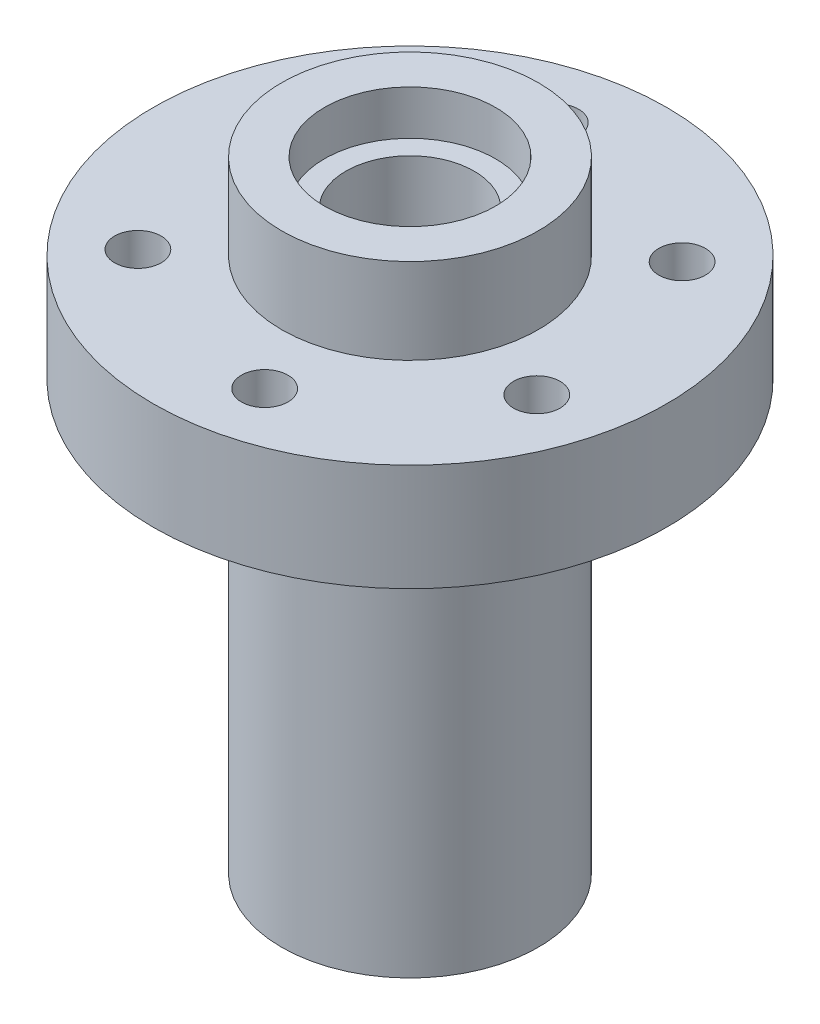
ISO-10303-21;
HEADER;
FILE_DESCRIPTION(('STEP AP214'),'2;1');
FILE_NAME('part.step','',(''),(''),'','','');
FILE_SCHEMA(('AUTOMOTIVE_DESIGN { 1 0 10303 214 1 1 1 1 }'));
ENDSEC;
DATA;
#1=APPLICATION_CONTEXT('core data for automotive mechanical design processes');
#2=APPLICATION_PROTOCOL_DEFINITION('international standard','automotive_design',2000,#1);
#3=PRODUCT_CONTEXT('',#1,'mechanical');
#4=PRODUCT('Part','Part','',(#3));
#5=PRODUCT_RELATED_PRODUCT_CATEGORY('part','',(#4));
#6=PRODUCT_DEFINITION_FORMATION('','',#4);
#7=PRODUCT_DEFINITION_CONTEXT('part definition',#1,'design');
#8=PRODUCT_DEFINITION('design','',#6,#7);
#9=PRODUCT_DEFINITION_SHAPE('','',#8);
#10=(LENGTH_UNIT() NAMED_UNIT(*) SI_UNIT(.MILLI.,.METRE.));
#11=(NAMED_UNIT(*) PLANE_ANGLE_UNIT() SI_UNIT($,.RADIAN.));
#12=(NAMED_UNIT(*) SI_UNIT($,.STERADIAN.) SOLID_ANGLE_UNIT());
#13=UNCERTAINTY_MEASURE_WITH_UNIT(LENGTH_MEASURE(1.E-05),#10,'distance_accuracy_value','');
#14=(GEOMETRIC_REPRESENTATION_CONTEXT(3) GLOBAL_UNCERTAINTY_ASSIGNED_CONTEXT((#13)) GLOBAL_UNIT_ASSIGNED_CONTEXT((#10,
#11,#12)) REPRESENTATION_CONTEXT('',''));
#15=CARTESIAN_POINT('',(0.,0.,0.));
#16=DIRECTION('',(0.,0.,1.));
#17=DIRECTION('',(1.,0.,0.));
#18=AXIS2_PLACEMENT_3D('',#15,#16,#17);
#19=CARTESIAN_POINT('',(0.,4.6355,0.));
#20=DIRECTION('',(0.,1.,0.));
#21=DIRECTION('',(0.,0.,1.));
#22=AXIS2_PLACEMENT_3D('',#19,#20,#21);
#23=PLANE('',#22);
#24=CARTESIAN_POINT('',(0.,4.6355,0.));
#25=DIRECTION('',(0.,1.,0.));
#26=DIRECTION('',(0.,0.,1.));
#27=AXIS2_PLACEMENT_3D('',#24,#25,#26);
#28=CIRCLE('',#27,4.7625);
#29=CARTESIAN_POINT('',(0.,4.6355,4.7625));
#30=VERTEX_POINT('',#29);
#31=EDGE_CURVE('E38',#30,#30,#28,.T.);
#32=ORIENTED_EDGE('',*,*,#31,.T.);
#33=EDGE_LOOP('',(#32));
#34=FACE_BOUND('',#33,.T.);
#35=ADVANCED_FACE('F35',(#34),#23,.T.);
#36=CARTESIAN_POINT('',(0.,4.6355,0.));
#37=DIRECTION('',(0.,1.,0.));
#38=DIRECTION('',(0.,0.,1.));
#39=AXIS2_PLACEMENT_3D('',#36,#37,#38);
#40=CYLINDRICAL_SURFACE('',#39,4.7625);
#41=CARTESIAN_POINT('',(0.,10.9855,0.));
#42=DIRECTION('',(0.,1.,0.));
#43=DIRECTION('',(0.,0.,1.));
#44=AXIS2_PLACEMENT_3D('',#41,#42,#43);
#45=CIRCLE('',#44,4.7625);
#46=CARTESIAN_POINT('',(0.,10.9855,4.7625));
#47=VERTEX_POINT('',#46);
#48=EDGE_CURVE('E126',#47,#47,#45,.F.);
#49=ORIENTED_EDGE('',*,*,#48,.F.);
#50=EDGE_LOOP('',(#49));
#51=FACE_BOUND('',#50,.T.);
#52=ORIENTED_EDGE('',*,*,#31,.F.);
#53=EDGE_LOOP('',(#52));
#54=FACE_BOUND('',#53,.T.);
#55=ADVANCED_FACE('F134',(#51,#54),#40,.F.);
#56=CARTESIAN_POINT('',(0.,10.9855,0.));
#57=DIRECTION('',(0.,1.,0.));
#58=DIRECTION('',(0.,0.,1.));
#59=AXIS2_PLACEMENT_3D('',#56,#57,#58);
#60=PLANE('',#59);
#61=ORIENTED_EDGE('',*,*,#48,.T.);
#62=EDGE_LOOP('',(#61));
#63=FACE_BOUND('',#62,.T.);
#64=CARTESIAN_POINT('',(0.,10.9855,0.));
#65=DIRECTION('',(0.,1.,0.));
#66=DIRECTION('',(0.,0.,1.));
#67=AXIS2_PLACEMENT_3D('',#64,#65,#66);
#68=CIRCLE('',#67,6.35);
#69=CARTESIAN_POINT('',(0.,10.9855,6.35));
#70=VERTEX_POINT('',#69);
#71=EDGE_CURVE('E124',#70,#70,#68,.T.);
#72=ORIENTED_EDGE('',*,*,#71,.T.);
#73=EDGE_LOOP('',(#72));
#74=FACE_BOUND('',#73,.T.);
#75=ADVANCED_FACE('F136',(#63,#74),#60,.T.);
#76=CARTESIAN_POINT('',(0.,10.9855,0.));
#77=DIRECTION('',(0.,1.,0.));
#78=DIRECTION('',(0.,0.,1.));
#79=AXIS2_PLACEMENT_3D('',#76,#77,#78);
#80=CYLINDRICAL_SURFACE('',#79,6.35);
#81=CARTESIAN_POINT('',(0.,14.2875,0.));
#82=DIRECTION('',(0.,1.,0.));
#83=DIRECTION('',(0.,0.,1.));
#84=AXIS2_PLACEMENT_3D('',#81,#82,#83);
#85=CIRCLE('',#84,6.35);
#86=CARTESIAN_POINT('',(0.,14.2875,6.35));
#87=VERTEX_POINT('',#86);
#88=EDGE_CURVE('E121',#87,#87,#85,.F.);
#89=ORIENTED_EDGE('',*,*,#88,.F.);
#90=EDGE_LOOP('',(#89));
#91=FACE_BOUND('',#90,.T.);
#92=ORIENTED_EDGE('',*,*,#71,.F.);
#93=EDGE_LOOP('',(#92));
#94=FACE_BOUND('',#93,.T.);
#95=ADVANCED_FACE('F142',(#91,#94),#80,.F.);
#96=CARTESIAN_POINT('',(0.,14.2875,0.));
#97=DIRECTION('',(0.,1.,0.));
#98=DIRECTION('',(0.,0.,1.));
#99=AXIS2_PLACEMENT_3D('',#96,#97,#98);
#100=PLANE('',#99);
#101=ORIENTED_EDGE('',*,*,#88,.T.);
#102=EDGE_LOOP('',(#101));
#103=FACE_BOUND('',#102,.T.);
#104=CARTESIAN_POINT('',(0.,14.2875,0.));
#105=DIRECTION('',(0.,-1.,0.));
#106=DIRECTION('',(0.,0.,-1.));
#107=AXIS2_PLACEMENT_3D('',#104,#105,#106);
#108=CIRCLE('',#107,9.525);
#109=CARTESIAN_POINT('',(0.,14.2875,-9.525));
#110=VERTEX_POINT('',#109);
#111=EDGE_CURVE('E118',#110,#110,#108,.T.);
#112=ORIENTED_EDGE('',*,*,#111,.F.);
#113=EDGE_LOOP('',(#112));
#114=FACE_BOUND('',#113,.T.);
#115=ADVANCED_FACE('F202',(#103,#114),#100,.T.);
#116=CARTESIAN_POINT('',(0.,14.2875,0.));
#117=DIRECTION('',(0.,-1.,0.));
#118=DIRECTION('',(0.,0.,-1.));
#119=AXIS2_PLACEMENT_3D('',#116,#117,#118);
#120=CYLINDRICAL_SURFACE('',#119,9.525);
#121=CARTESIAN_POINT('',(0.,7.9375,0.));
#122=DIRECTION('',(0.,-1.,0.));
#123=DIRECTION('',(0.,0.,-1.));
#124=AXIS2_PLACEMENT_3D('',#121,#122,#123);
#125=CIRCLE('',#124,9.525);
#126=CARTESIAN_POINT('',(0.,7.9375,-9.525));
#127=VERTEX_POINT('',#126);
#128=EDGE_CURVE('E115',#127,#127,#125,.T.);
#129=ORIENTED_EDGE('',*,*,#128,.F.);
#130=EDGE_LOOP('',(#129));
#131=FACE_BOUND('',#130,.T.);
#132=ORIENTED_EDGE('',*,*,#111,.T.);
#133=EDGE_LOOP('',(#132));
#134=FACE_BOUND('',#133,.T.);
#135=ADVANCED_FACE('F198',(#131,#134),#120,.T.);
#136=CARTESIAN_POINT('',(0.,7.9375,0.));
#137=DIRECTION('',(0.,1.,0.));
#138=DIRECTION('',(0.,0.,1.));
#139=AXIS2_PLACEMENT_3D('',#136,#137,#138);
#140=PLANE('',#139);
#141=ORIENTED_EDGE('',*,*,#128,.T.);
#142=EDGE_LOOP('',(#141));
#143=FACE_BOUND('',#142,.T.);
#144=CARTESIAN_POINT('',(-3.15328380216424,7.9375,-13.9351877458833));
#145=DIRECTION('',(0.,1.,0.));
#146=DIRECTION('',(0.,0.,1.));
#147=AXIS2_PLACEMENT_3D('',#144,#145,#146);
#148=CIRCLE('',#147,1.72719999999999);
#149=CARTESIAN_POINT('',(-3.15328380216424,7.9375,-12.2079877458834));
#150=VERTEX_POINT('',#149);
#151=EDGE_CURVE('E94',#150,#150,#148,.F.);
#152=ORIENTED_EDGE('',*,*,#151,.T.);
#153=EDGE_LOOP('',(#152));
#154=FACE_BOUND('',#153,.T.);
#155=CARTESIAN_POINT('',(-13.6448684955223,7.9375,-4.23676999492549));
#156=DIRECTION('',(0.,1.,0.));
#157=DIRECTION('',(0.,0.,1.));
#158=AXIS2_PLACEMENT_3D('',#155,#156,#157);
#159=CIRCLE('',#158,1.72719999999999);
#160=CARTESIAN_POINT('',(-13.6448684955223,7.9375,-2.5095699949255));
#161=VERTEX_POINT('',#160);
#162=EDGE_CURVE('E97',#161,#161,#159,.F.);
#163=ORIENTED_EDGE('',*,*,#162,.T.);
#164=EDGE_LOOP('',(#163));
#165=FACE_BOUND('',#164,.T.);
#166=CARTESIAN_POINT('',(-10.4915846933581,7.9375,9.69841775095735));
#167=DIRECTION('',(0.,1.,0.));
#168=DIRECTION('',(0.,0.,1.));
#169=AXIS2_PLACEMENT_3D('',#166,#167,#168);
#170=CIRCLE('',#169,1.72719999999999);
#171=CARTESIAN_POINT('',(-10.4915846933581,7.9375,11.4256177509573));
#172=VERTEX_POINT('',#171);
#173=EDGE_CURVE('E100',#172,#172,#170,.F.);
#174=ORIENTED_EDGE('',*,*,#173,.T.);
#175=EDGE_LOOP('',(#174));
#176=FACE_BOUND('',#175,.T.);
#177=CARTESIAN_POINT('',(3.1532838021644,7.9375,13.9351877458827));
#178=DIRECTION('',(0.,1.,0.));
#179=DIRECTION('',(0.,0.,1.));
#180=AXIS2_PLACEMENT_3D('',#177,#178,#179);
#181=CIRCLE('',#180,1.72719999999999);
#182=CARTESIAN_POINT('',(3.1532838021644,7.9375,15.6623877458827));
#183=VERTEX_POINT('',#182);
#184=EDGE_CURVE('E103',#183,#183,#181,.F.);
#185=ORIENTED_EDGE('',*,*,#184,.T.);
#186=EDGE_LOOP('',(#185));
#187=FACE_BOUND('',#186,.T.);
#188=CARTESIAN_POINT('',(13.6448684955226,7.9375,4.23676999492494));
#189=DIRECTION('',(0.,1.,0.));
#190=DIRECTION('',(0.,0.,1.));
#191=AXIS2_PLACEMENT_3D('',#188,#189,#190);
#192=CIRCLE('',#191,1.72719999999999);
#193=CARTESIAN_POINT('',(13.6448684955226,7.9375,5.96396999492493));
#194=VERTEX_POINT('',#193);
#195=EDGE_CURVE('E106',#194,#194,#192,.F.);
#196=ORIENTED_EDGE('',*,*,#195,.T.);
#197=EDGE_LOOP('',(#196));
#198=FACE_BOUND('',#197,.T.);
#199=CARTESIAN_POINT('',(10.4915846933583,7.9375,-9.69841775095814));
#200=DIRECTION('',(0.,1.,0.));
#201=DIRECTION('',(0.,0.,1.));
#202=AXIS2_PLACEMENT_3D('',#199,#200,#201);
#203=CIRCLE('',#202,1.72719999999999);
#204=CARTESIAN_POINT('',(10.4915846933583,7.9375,-7.97121775095815));
#205=VERTEX_POINT('',#204);
#206=EDGE_CURVE('E109',#205,#205,#203,.F.);
#207=ORIENTED_EDGE('',*,*,#206,.T.);
#208=EDGE_LOOP('',(#207));
#209=FACE_BOUND('',#208,.T.);
#210=CARTESIAN_POINT('',(0.,7.9375,0.));
#211=DIRECTION('',(0.,-1.,0.));
#212=DIRECTION('',(0.,0.,-1.));
#213=AXIS2_PLACEMENT_3D('',#210,#211,#212);
#214=CIRCLE('',#213,19.05);
#215=CARTESIAN_POINT('',(0.,7.9375,-19.05));
#216=VERTEX_POINT('',#215);
#217=EDGE_CURVE('E112',#216,#216,#214,.T.);
#218=ORIENTED_EDGE('',*,*,#217,.F.);
#219=EDGE_LOOP('',(#218));
#220=FACE_BOUND('',#219,.T.);
#221=ADVANCED_FACE('F194',(#143,#154,#165,#176,#187,#198,#209,#220),#140,.T.);
#222=CARTESIAN_POINT('',(0.,7.9375,0.));
#223=DIRECTION('',(0.,-1.,0.));
#224=DIRECTION('',(0.,0.,-1.));
#225=AXIS2_PLACEMENT_3D('',#222,#223,#224);
#226=CYLINDRICAL_SURFACE('',#225,19.05);
#227=CARTESIAN_POINT('',(0.,0.,0.));
#228=DIRECTION('',(0.,-1.,0.));
#229=DIRECTION('',(0.,0.,-1.));
#230=AXIS2_PLACEMENT_3D('',#227,#228,#229);
#231=CIRCLE('',#230,19.05);
#232=CARTESIAN_POINT('',(0.,0.,-19.05));
#233=VERTEX_POINT('',#232);
#234=EDGE_CURVE('E91',#233,#233,#231,.F.);
#235=ORIENTED_EDGE('',*,*,#234,.T.);
#236=EDGE_LOOP('',(#235));
#237=FACE_BOUND('',#236,.T.);
#238=ORIENTED_EDGE('',*,*,#217,.T.);
#239=EDGE_LOOP('',(#238));
#240=FACE_BOUND('',#239,.T.);
#241=ADVANCED_FACE('F190',(#237,#240),#226,.T.);
#242=CARTESIAN_POINT('',(10.4915846933583,7.9375,-9.69841775095814));
#243=DIRECTION('',(0.,1.,0.));
#244=DIRECTION('',(0.,0.,1.));
#245=AXIS2_PLACEMENT_3D('',#242,#243,#244);
#246=CYLINDRICAL_SURFACE('',#245,1.72719999999999);
#247=ORIENTED_EDGE('',*,*,#206,.F.);
#248=EDGE_LOOP('',(#247));
#249=FACE_BOUND('',#248,.T.);
#250=CARTESIAN_POINT('',(10.4915846933583,0.,-9.69841775095814));
#251=DIRECTION('',(0.,1.,0.));
#252=DIRECTION('',(0.,0.,1.));
#253=AXIS2_PLACEMENT_3D('',#250,#251,#252);
#254=CIRCLE('',#253,1.72719999999999);
#255=CARTESIAN_POINT('',(10.4915846933583,0.,-7.97121775095815));
#256=VERTEX_POINT('',#255);
#257=EDGE_CURVE('E88',#256,#256,#254,.F.);
#258=ORIENTED_EDGE('',*,*,#257,.T.);
#259=EDGE_LOOP('',(#258));
#260=FACE_BOUND('',#259,.T.);
#261=ADVANCED_FACE('F186',(#249,#260),#246,.F.);
#262=CARTESIAN_POINT('',(13.6448684955226,7.9375,4.23676999492494));
#263=DIRECTION('',(0.,1.,0.));
#264=DIRECTION('',(0.,0.,1.));
#265=AXIS2_PLACEMENT_3D('',#262,#263,#264);
#266=CYLINDRICAL_SURFACE('',#265,1.72719999999999);
#267=ORIENTED_EDGE('',*,*,#195,.F.);
#268=EDGE_LOOP('',(#267));
#269=FACE_BOUND('',#268,.T.);
#270=CARTESIAN_POINT('',(13.6448684955226,0.,4.23676999492494));
#271=DIRECTION('',(0.,1.,0.));
#272=DIRECTION('',(0.,0.,1.));
#273=AXIS2_PLACEMENT_3D('',#270,#271,#272);
#274=CIRCLE('',#273,1.72719999999999);
#275=CARTESIAN_POINT('',(13.6448684955226,0.,5.96396999492493));
#276=VERTEX_POINT('',#275);
#277=EDGE_CURVE('E85',#276,#276,#274,.F.);
#278=ORIENTED_EDGE('',*,*,#277,.T.);
#279=EDGE_LOOP('',(#278));
#280=FACE_BOUND('',#279,.T.);
#281=ADVANCED_FACE('F182',(#269,#280),#266,.F.);
#282=CARTESIAN_POINT('',(3.1532838021644,7.9375,13.9351877458827));
#283=DIRECTION('',(0.,1.,0.));
#284=DIRECTION('',(0.,0.,1.));
#285=AXIS2_PLACEMENT_3D('',#282,#283,#284);
#286=CYLINDRICAL_SURFACE('',#285,1.72719999999999);
#287=ORIENTED_EDGE('',*,*,#184,.F.);
#288=EDGE_LOOP('',(#287));
#289=FACE_BOUND('',#288,.T.);
#290=CARTESIAN_POINT('',(3.1532838021644,0.,13.9351877458827));
#291=DIRECTION('',(0.,1.,0.));
#292=DIRECTION('',(0.,0.,1.));
#293=AXIS2_PLACEMENT_3D('',#290,#291,#292);
#294=CIRCLE('',#293,1.72719999999999);
#295=CARTESIAN_POINT('',(3.1532838021644,0.,15.6623877458827));
#296=VERTEX_POINT('',#295);
#297=EDGE_CURVE('E82',#296,#296,#294,.F.);
#298=ORIENTED_EDGE('',*,*,#297,.T.);
#299=EDGE_LOOP('',(#298));
#300=FACE_BOUND('',#299,.T.);
#301=ADVANCED_FACE('F178',(#289,#300),#286,.F.);
#302=CARTESIAN_POINT('',(-10.4915846933581,7.9375,9.69841775095735));
#303=DIRECTION('',(0.,1.,0.));
#304=DIRECTION('',(0.,0.,1.));
#305=AXIS2_PLACEMENT_3D('',#302,#303,#304);
#306=CYLINDRICAL_SURFACE('',#305,1.72719999999999);
#307=ORIENTED_EDGE('',*,*,#173,.F.);
#308=EDGE_LOOP('',(#307));
#309=FACE_BOUND('',#308,.T.);
#310=CARTESIAN_POINT('',(-10.4915846933581,0.,9.69841775095735));
#311=DIRECTION('',(0.,1.,0.));
#312=DIRECTION('',(0.,0.,1.));
#313=AXIS2_PLACEMENT_3D('',#310,#311,#312);
#314=CIRCLE('',#313,1.72719999999999);
#315=CARTESIAN_POINT('',(-10.4915846933581,0.,11.4256177509573));
#316=VERTEX_POINT('',#315);
#317=EDGE_CURVE('E79',#316,#316,#314,.F.);
#318=ORIENTED_EDGE('',*,*,#317,.T.);
#319=EDGE_LOOP('',(#318));
#320=FACE_BOUND('',#319,.T.);
#321=ADVANCED_FACE('F174',(#309,#320),#306,.F.);
#322=CARTESIAN_POINT('',(-13.6448684955223,7.9375,-4.23676999492549));
#323=DIRECTION('',(0.,1.,0.));
#324=DIRECTION('',(0.,0.,1.));
#325=AXIS2_PLACEMENT_3D('',#322,#323,#324);
#326=CYLINDRICAL_SURFACE('',#325,1.72719999999999);
#327=ORIENTED_EDGE('',*,*,#162,.F.);
#328=EDGE_LOOP('',(#327));
#329=FACE_BOUND('',#328,.T.);
#330=CARTESIAN_POINT('',(-13.6448684955223,0.,-4.23676999492549));
#331=DIRECTION('',(0.,1.,0.));
#332=DIRECTION('',(0.,0.,1.));
#333=AXIS2_PLACEMENT_3D('',#330,#331,#332);
#334=CIRCLE('',#333,1.72719999999999);
#335=CARTESIAN_POINT('',(-13.6448684955223,0.,-2.5095699949255));
#336=VERTEX_POINT('',#335);
#337=EDGE_CURVE('E76',#336,#336,#334,.F.);
#338=ORIENTED_EDGE('',*,*,#337,.T.);
#339=EDGE_LOOP('',(#338));
#340=FACE_BOUND('',#339,.T.);
#341=ADVANCED_FACE('F170',(#329,#340),#326,.F.);
#342=CARTESIAN_POINT('',(-3.15328380216424,7.9375,-13.9351877458833));
#343=DIRECTION('',(0.,1.,0.));
#344=DIRECTION('',(0.,0.,1.));
#345=AXIS2_PLACEMENT_3D('',#342,#343,#344);
#346=CYLINDRICAL_SURFACE('',#345,1.72719999999999);
#347=ORIENTED_EDGE('',*,*,#151,.F.);
#348=EDGE_LOOP('',(#347));
#349=FACE_BOUND('',#348,.T.);
#350=CARTESIAN_POINT('',(-3.15328380216424,0.,-13.9351877458833));
#351=DIRECTION('',(0.,1.,0.));
#352=DIRECTION('',(0.,0.,1.));
#353=AXIS2_PLACEMENT_3D('',#350,#351,#352);
#354=CIRCLE('',#353,1.72719999999999);
#355=CARTESIAN_POINT('',(-3.15328380216424,0.,-12.2079877458834));
#356=VERTEX_POINT('',#355);
#357=EDGE_CURVE('E73',#356,#356,#354,.F.);
#358=ORIENTED_EDGE('',*,*,#357,.T.);
#359=EDGE_LOOP('',(#358));
#360=FACE_BOUND('',#359,.T.);
#361=ADVANCED_FACE('F166',(#349,#360),#346,.F.);
#362=CARTESIAN_POINT('',(0.,0.,0.));
#363=DIRECTION('',(0.,1.,0.));
#364=DIRECTION('',(0.,0.,1.));
#365=AXIS2_PLACEMENT_3D('',#362,#363,#364);
#366=PLANE('',#365);
#367=CARTESIAN_POINT('',(0.,0.,0.));
#368=DIRECTION('',(0.,1.,0.));
#369=DIRECTION('',(0.,0.,1.));
#370=AXIS2_PLACEMENT_3D('',#367,#368,#369);
#371=CIRCLE('',#370,9.525);
#372=CARTESIAN_POINT('',(0.,0.,9.525));
#373=VERTEX_POINT('',#372);
#374=EDGE_CURVE('E43',#373,#373,#371,.F.);
#375=ORIENTED_EDGE('',*,*,#374,.F.);
#376=EDGE_LOOP('',(#375));
#377=FACE_BOUND('',#376,.T.);
#378=ORIENTED_EDGE('',*,*,#357,.F.);
#379=EDGE_LOOP('',(#378));
#380=FACE_BOUND('',#379,.T.);
#381=ORIENTED_EDGE('',*,*,#337,.F.);
#382=EDGE_LOOP('',(#381));
#383=FACE_BOUND('',#382,.T.);
#384=ORIENTED_EDGE('',*,*,#317,.F.);
#385=EDGE_LOOP('',(#384));
#386=FACE_BOUND('',#385,.T.);
#387=ORIENTED_EDGE('',*,*,#297,.F.);
#388=EDGE_LOOP('',(#387));
#389=FACE_BOUND('',#388,.T.);
#390=ORIENTED_EDGE('',*,*,#277,.F.);
#391=EDGE_LOOP('',(#390));
#392=FACE_BOUND('',#391,.T.);
#393=ORIENTED_EDGE('',*,*,#257,.F.);
#394=EDGE_LOOP('',(#393));
#395=FACE_BOUND('',#394,.T.);
#396=ORIENTED_EDGE('',*,*,#234,.F.);
#397=EDGE_LOOP('',(#396));
#398=FACE_BOUND('',#397,.T.);
#399=ADVANCED_FACE('F158',(#377,#380,#383,#386,#389,#392,#395,#398),#366,.F.);
#400=CARTESIAN_POINT('',(0.,-31.75,0.));
#401=DIRECTION('',(0.,-1.,0.));
#402=DIRECTION('',(0.,0.,-1.));
#403=AXIS2_PLACEMENT_3D('',#400,#401,#402);
#404=PLANE('',#403);
#405=CARTESIAN_POINT('',(0.,-31.75,6.35));
#406=DIRECTION('',(0.,-1.,0.));
#407=DIRECTION('',(0.,0.,-1.));
#408=AXIS2_PLACEMENT_3D('',#405,#406,#407);
#409=CIRCLE('',#408,2.65429999999999);
#410=CARTESIAN_POINT('',(0.,-31.75,3.69570000000001));
#411=VERTEX_POINT('',#410);
#412=EDGE_CURVE('E61',#411,#411,#409,.T.);
#413=ORIENTED_EDGE('',*,*,#412,.F.);
#414=EDGE_LOOP('',(#413));
#415=FACE_BOUND('',#414,.T.);
#416=CARTESIAN_POINT('',(0.,-31.75,-6.35));
#417=DIRECTION('',(0.,-1.,0.));
#418=DIRECTION('',(0.,0.,-1.));
#419=AXIS2_PLACEMENT_3D('',#416,#417,#418);
#420=CIRCLE('',#419,2.65429999999999);
#421=CARTESIAN_POINT('',(0.,-31.75,-9.00429999999999));
#422=VERTEX_POINT('',#421);
#423=EDGE_CURVE('E60',#422,#422,#420,.T.);
#424=ORIENTED_EDGE('',*,*,#423,.F.);
#425=EDGE_LOOP('',(#424));
#426=FACE_BOUND('',#425,.T.);
#427=CARTESIAN_POINT('',(0.,-31.75,0.));
#428=DIRECTION('',(0.,1.,0.));
#429=DIRECTION('',(0.,0.,1.));
#430=AXIS2_PLACEMENT_3D('',#427,#428,#429);
#431=CIRCLE('',#430,9.525);
#432=CARTESIAN_POINT('',(0.,-31.75,9.525));
#433=VERTEX_POINT('',#432);
#434=EDGE_CURVE('E11',#433,#433,#431,.T.);
#435=ORIENTED_EDGE('',*,*,#434,.F.);
#436=EDGE_LOOP('',(#435));
#437=FACE_BOUND('',#436,.T.);
#438=ADVANCED_FACE('F148',(#415,#426,#437),#404,.T.);
#439=CARTESIAN_POINT('',(0.,-31.75,0.));
#440=DIRECTION('',(0.,1.,0.));
#441=DIRECTION('',(0.,0.,1.));
#442=AXIS2_PLACEMENT_3D('',#439,#440,#441);
#443=CYLINDRICAL_SURFACE('',#442,9.525);
#444=ORIENTED_EDGE('',*,*,#374,.T.);
#445=EDGE_LOOP('',(#444));
#446=FACE_BOUND('',#445,.T.);
#447=ORIENTED_EDGE('',*,*,#434,.T.);
#448=EDGE_LOOP('',(#447));
#449=FACE_BOUND('',#448,.T.);
#450=ADVANCED_FACE('F146',(#446,#449),#443,.T.);
#451=CARTESIAN_POINT('',(0.,-25.4,-6.35));
#452=DIRECTION('',(0.,-1.,0.));
#453=DIRECTION('',(0.,0.,-1.));
#454=AXIS2_PLACEMENT_3D('',#451,#452,#453);
#455=CONICAL_SURFACE('',#454,2.6543,1.02974425867665);
#456=CARTESIAN_POINT('',(0.,-23.8051356589151,-6.35));
#457=VERTEX_POINT('',#456);
#458=VERTEX_LOOP('',#457);
#459=FACE_BOUND('',#458,.T.);
#460=CARTESIAN_POINT('',(0.,-25.4,-6.35));
#461=DIRECTION('',(0.,-1.,0.));
#462=DIRECTION('',(0.,0.,-1.));
#463=AXIS2_PLACEMENT_3D('',#460,#461,#462);
#464=CIRCLE('',#463,2.6543);
#465=CARTESIAN_POINT('',(0.,-25.4,-9.0043));
#466=VERTEX_POINT('',#465);
#467=EDGE_CURVE('E64',#466,#466,#464,.T.);
#468=ORIENTED_EDGE('',*,*,#467,.T.);
#469=EDGE_LOOP('',(#468));
#470=FACE_BOUND('',#469,.T.);
#471=ADVANCED_FACE('F145',(#459,#470),#455,.F.);
#472=CARTESIAN_POINT('',(0.,-31.75,-6.35));
#473=DIRECTION('',(0.,-1.,0.));
#474=DIRECTION('',(0.,0.,-1.));
#475=AXIS2_PLACEMENT_3D('',#472,#473,#474);
#476=CYLINDRICAL_SURFACE('',#475,2.65429999999999);
#477=ORIENTED_EDGE('',*,*,#467,.F.);
#478=EDGE_LOOP('',(#477));
#479=FACE_BOUND('',#478,.T.);
#480=ORIENTED_EDGE('',*,*,#423,.T.);
#481=EDGE_LOOP('',(#480));
#482=FACE_BOUND('',#481,.T.);
#483=ADVANCED_FACE('F54',(#479,#482),#476,.F.);
#484=CARTESIAN_POINT('',(0.,-25.4,6.35));
#485=DIRECTION('',(0.,-1.,0.));
#486=DIRECTION('',(0.,0.,-1.));
#487=AXIS2_PLACEMENT_3D('',#484,#485,#486);
#488=CONICAL_SURFACE('',#487,2.6543,1.02974425867665);
#489=CARTESIAN_POINT('',(0.,-23.8051356589151,6.35));
#490=VERTEX_POINT('',#489);
#491=VERTEX_LOOP('',#490);
#492=FACE_BOUND('',#491,.T.);
#493=CARTESIAN_POINT('',(0.,-25.4,6.35));
#494=DIRECTION('',(0.,-1.,0.));
#495=DIRECTION('',(0.,0.,-1.));
#496=AXIS2_PLACEMENT_3D('',#493,#494,#495);
#497=CIRCLE('',#496,2.6543);
#498=CARTESIAN_POINT('',(0.,-25.4,3.6957));
#499=VERTEX_POINT('',#498);
#500=EDGE_CURVE('E58',#499,#499,#497,.T.);
#501=ORIENTED_EDGE('',*,*,#500,.T.);
#502=EDGE_LOOP('',(#501));
#503=FACE_BOUND('',#502,.T.);
#504=ADVANCED_FACE('F50',(#492,#503),#488,.F.);
#505=CARTESIAN_POINT('',(0.,-31.75,6.35));
#506=DIRECTION('',(0.,-1.,0.));
#507=DIRECTION('',(0.,0.,-1.));
#508=AXIS2_PLACEMENT_3D('',#505,#506,#507);
#509=CYLINDRICAL_SURFACE('',#508,2.65429999999999);
#510=ORIENTED_EDGE('',*,*,#500,.F.);
#511=EDGE_LOOP('',(#510));
#512=FACE_BOUND('',#511,.T.);
#513=ORIENTED_EDGE('',*,*,#412,.T.);
#514=EDGE_LOOP('',(#513));
#515=FACE_BOUND('',#514,.T.);
#516=ADVANCED_FACE('F53',(#512,#515),#509,.F.);
#517=CLOSED_SHELL('',(#35,#55,#75,#95,#115,#135,#221,#241,#261,#281,#301,#321,#341,#361,#399,
#438,#450,#471,#483,#504,#516));
#518=MANIFOLD_SOLID_BREP('B2',#517);
#519=ADVANCED_BREP_SHAPE_REPRESENTATION('',(#18,#518),#14);
#520=SHAPE_DEFINITION_REPRESENTATION(#9,#519);
ENDSEC;
END-ISO-10303-21;
